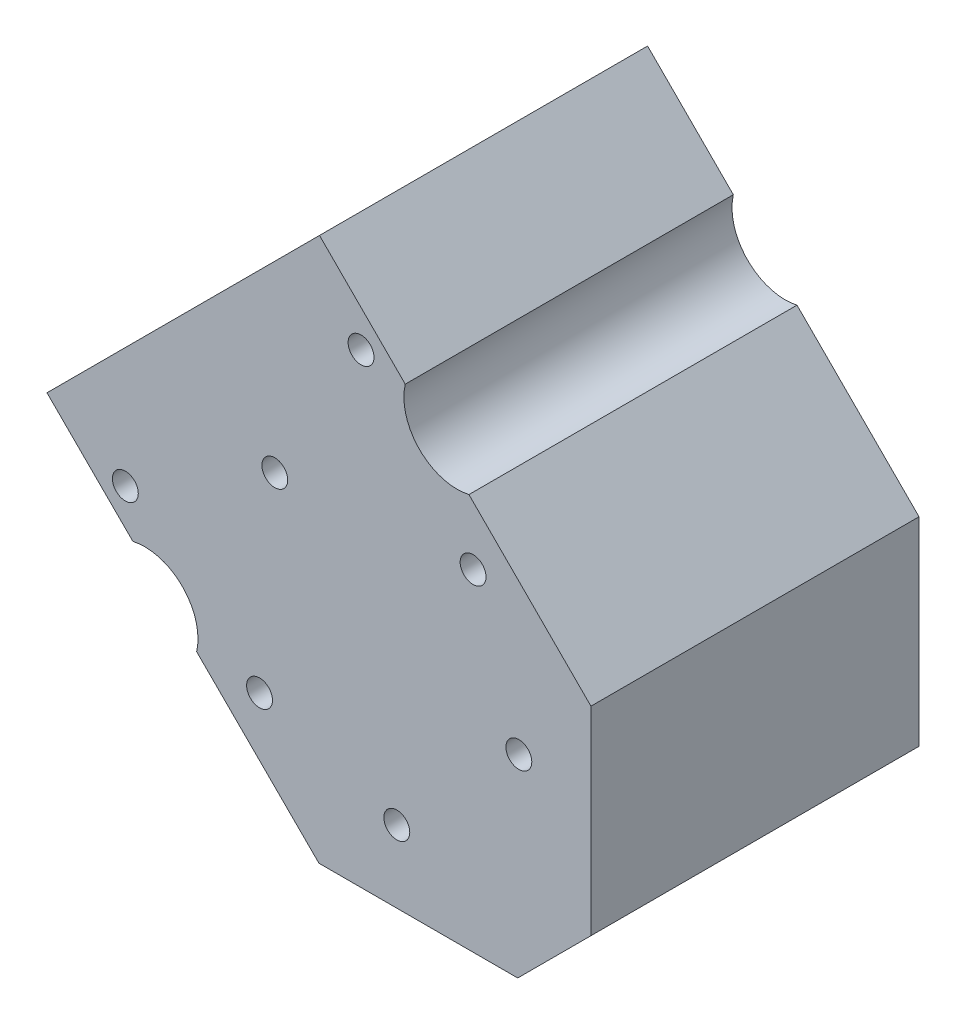
ISO-10303-21;
HEADER;
FILE_DESCRIPTION(('STEP AP214'),'2;1');
FILE_NAME('part.step','',(''),(''),'','','');
FILE_SCHEMA(('AUTOMOTIVE_DESIGN { 1 0 10303 214 1 1 1 1 }'));
ENDSEC;
DATA;
#1=APPLICATION_CONTEXT('core data for automotive mechanical design processes');
#2=APPLICATION_PROTOCOL_DEFINITION('international standard','automotive_design',2000,#1);
#3=PRODUCT_CONTEXT('',#1,'mechanical');
#4=PRODUCT('Part','Part','',(#3));
#5=PRODUCT_RELATED_PRODUCT_CATEGORY('part','',(#4));
#6=PRODUCT_DEFINITION_FORMATION('','',#4);
#7=PRODUCT_DEFINITION_CONTEXT('part definition',#1,'design');
#8=PRODUCT_DEFINITION('design','',#6,#7);
#9=PRODUCT_DEFINITION_SHAPE('','',#8);
#10=(LENGTH_UNIT() NAMED_UNIT(*) SI_UNIT(.MILLI.,.METRE.));
#11=(NAMED_UNIT(*) PLANE_ANGLE_UNIT() SI_UNIT($,.RADIAN.));
#12=(NAMED_UNIT(*) SI_UNIT($,.STERADIAN.) SOLID_ANGLE_UNIT());
#13=UNCERTAINTY_MEASURE_WITH_UNIT(LENGTH_MEASURE(1.E-05),#10,'distance_accuracy_value','');
#14=(GEOMETRIC_REPRESENTATION_CONTEXT(3) GLOBAL_UNCERTAINTY_ASSIGNED_CONTEXT((#13)) GLOBAL_UNIT_ASSIGNED_CONTEXT((#10,
#11,#12)) REPRESENTATION_CONTEXT('',''));
#15=CARTESIAN_POINT('',(0.,0.,0.));
#16=DIRECTION('',(0.,0.,1.));
#17=DIRECTION('',(1.,0.,0.));
#18=AXIS2_PLACEMENT_3D('',#15,#16,#17);
#19=CARTESIAN_POINT('',(-35.4852813742383,27.,38.0226));
#20=DIRECTION('',(-0.707106781186544,0.707106781186551,0.));
#21=DIRECTION('',(-0.707106781186551,-0.707106781186544,0.));
#22=AXIS2_PLACEMENT_3D('',#19,#20,#21);
#23=PLANE('',#22);
#24=DIRECTION('',(0.707106781186551,0.707106781186544,0.));
#25=VECTOR('',#24,1.);
#26=CARTESIAN_POINT('',(-35.4852813742383,27.,0.));
#27=LINE('',#26,#25);
#28=CARTESIAN_POINT('',(-35.4852813742383,27.,0.));
#29=VERTEX_POINT('',#28);
#30=CARTESIAN_POINT('',(-26.9999999999997,35.4852813742385,0.));
#31=VERTEX_POINT('',#30);
#32=EDGE_CURVE('E147',#29,#31,#27,.T.);
#33=ORIENTED_EDGE('',*,*,#32,.T.);
#34=DIRECTION('',(0.,0.,-1.));
#35=VECTOR('',#34,1.);
#36=CARTESIAN_POINT('',(-26.9999999999997,35.4852813742385,38.0226));
#37=LINE('',#36,#35);
#38=CARTESIAN_POINT('',(-26.9999999999997,35.4852813742385,38.0226));
#39=VERTEX_POINT('',#38);
#40=EDGE_CURVE('E11',#39,#31,#37,.T.);
#41=ORIENTED_EDGE('',*,*,#40,.F.);
#42=DIRECTION('',(0.707106781186551,0.707106781186544,0.));
#43=VECTOR('',#42,1.);
#44=CARTESIAN_POINT('',(-35.4852813742383,27.,38.0226));
#45=LINE('',#44,#43);
#46=CARTESIAN_POINT('',(-35.4852813742383,27.,38.0226));
#47=VERTEX_POINT('',#46);
#48=EDGE_CURVE('E166',#47,#39,#45,.T.);
#49=ORIENTED_EDGE('',*,*,#48,.F.);
#50=DIRECTION('',(0.,0.,-1.));
#51=VECTOR('',#50,1.);
#52=CARTESIAN_POINT('',(-35.4852813742383,27.,38.0226));
#53=LINE('',#52,#51);
#54=EDGE_CURVE('E143',#47,#29,#53,.T.);
#55=ORIENTED_EDGE('',*,*,#54,.T.);
#56=EDGE_LOOP('',(#33,#41,#49,#55));
#57=FACE_BOUND('',#56,.T.);
#58=ADVANCED_FACE('F39',(#57),#23,.F.);
#59=CARTESIAN_POINT('',(-26.9999999999997,35.4852813742385,38.0226));
#60=DIRECTION('',(-1.,0.,0.));
#61=DIRECTION('',(0.,0.,1.));
#62=AXIS2_PLACEMENT_3D('',#59,#60,#61);
#63=PLANE('',#62);
#64=DIRECTION('',(0.,1.,0.));
#65=VECTOR('',#64,1.);
#66=CARTESIAN_POINT('',(-26.9999999999997,35.4852813742385,0.));
#67=LINE('',#66,#65);
#68=CARTESIAN_POINT('',(-26.9999999999997,58.5251089466039,0.));
#69=VERTEX_POINT('',#68);
#70=EDGE_CURVE('E150',#31,#69,#67,.T.);
#71=ORIENTED_EDGE('',*,*,#70,.T.);
#72=DIRECTION('',(0.,0.,-1.));
#73=VECTOR('',#72,1.);
#74=CARTESIAN_POINT('',(-26.9999999999997,58.5251089466039,38.0226));
#75=LINE('',#74,#73);
#76=CARTESIAN_POINT('',(-26.9999999999997,58.5251089466039,38.0226));
#77=VERTEX_POINT('',#76);
#78=EDGE_CURVE('E47',#77,#69,#75,.T.);
#79=ORIENTED_EDGE('',*,*,#78,.F.);
#80=DIRECTION('',(0.,1.,0.));
#81=VECTOR('',#80,1.);
#82=CARTESIAN_POINT('',(-26.9999999999997,35.4852813742385,38.0226));
#83=LINE('',#82,#81);
#84=EDGE_CURVE('E104',#39,#77,#83,.T.);
#85=ORIENTED_EDGE('',*,*,#84,.F.);
#86=ORIENTED_EDGE('',*,*,#40,.T.);
#87=EDGE_LOOP('',(#71,#79,#85,#86));
#88=FACE_BOUND('',#87,.T.);
#89=ADVANCED_FACE('F282',(#88),#63,.F.);
#90=CARTESIAN_POINT('',(-26.9999999999997,58.5251089466039,38.0226));
#91=DIRECTION('',(-0.707759513444588,-0.706453445832547,0.));
#92=DIRECTION('',(0.706453445832547,-0.707759513444588,0.));
#93=AXIS2_PLACEMENT_3D('',#90,#91,#92);
#94=PLANE('',#93);
#95=DIRECTION('',(-0.706453445832547,0.707759513444588,0.));
#96=VECTOR('',#95,1.);
#97=CARTESIAN_POINT('',(-26.9999999999997,58.5251089466039,0.));
#98=LINE('',#97,#96);
#99=CARTESIAN_POINT('',(-41.1410793645048,72.6923318678659,0.));
#100=VERTEX_POINT('',#99);
#101=EDGE_CURVE('E153',#69,#100,#98,.T.);
#102=ORIENTED_EDGE('',*,*,#101,.T.);
#103=DIRECTION('',(0.,0.,-1.));
#104=VECTOR('',#103,1.);
#105=CARTESIAN_POINT('',(-41.1410793645048,72.6923318678659,38.0226));
#106=LINE('',#105,#104);
#107=CARTESIAN_POINT('',(-41.1410793645048,72.6923318678659,38.0226));
#108=VERTEX_POINT('',#107);
#109=EDGE_CURVE('E179',#108,#100,#106,.T.);
#110=ORIENTED_EDGE('',*,*,#109,.F.);
#111=DIRECTION('',(-0.706453445832547,0.707759513444588,0.));
#112=VECTOR('',#111,1.);
#113=CARTESIAN_POINT('',(-26.9999999999997,58.5251089466039,38.0226));
#114=LINE('',#113,#112);
#115=EDGE_CURVE('E187',#77,#108,#114,.T.);
#116=ORIENTED_EDGE('',*,*,#115,.F.);
#117=ORIENTED_EDGE('',*,*,#78,.T.);
#118=EDGE_LOOP('',(#102,#110,#116,#117));
#119=FACE_BOUND('',#118,.T.);
#120=ADVANCED_FACE('F185',(#119),#94,.F.);
#121=CARTESIAN_POINT('',(-42.5030038577654,78.7126909334408,38.0226));
#122=DIRECTION('',(0.,0.,-1.));
#123=DIRECTION('',(-1.,0.,0.));
#124=AXIS2_PLACEMENT_3D('',#121,#122,#123);
#125=CYLINDRICAL_SURFACE('',#124,6.17248423276982);
#126=CARTESIAN_POINT('',(-42.5030038577654,78.7126909334408,0.));
#127=DIRECTION('',(0.,0.,-1.));
#128=DIRECTION('',(1.,0.,0.));
#129=AXIS2_PLACEMENT_3D('',#126,#127,#128);
#130=CIRCLE('',#129,6.17248423276982);
#131=CARTESIAN_POINT('',(-48.5208371005556,80.0857330543389,0.));
#132=VERTEX_POINT('',#131);
#133=EDGE_CURVE('E155',#100,#132,#130,.T.);
#134=ORIENTED_EDGE('',*,*,#133,.T.);
#135=DIRECTION('',(0.,0.,-1.));
#136=VECTOR('',#135,1.);
#137=CARTESIAN_POINT('',(-48.5208371005556,80.0857330543389,38.0226));
#138=LINE('',#137,#136);
#139=CARTESIAN_POINT('',(-48.5208371005556,80.0857330543389,38.0226));
#140=VERTEX_POINT('',#139);
#141=EDGE_CURVE('E176',#140,#132,#138,.T.);
#142=ORIENTED_EDGE('',*,*,#141,.F.);
#143=CARTESIAN_POINT('',(-42.5030038577654,78.7126909334408,38.0226));
#144=DIRECTION('',(0.,0.,-1.));
#145=DIRECTION('',(1.,0.,0.));
#146=AXIS2_PLACEMENT_3D('',#143,#144,#145);
#147=CIRCLE('',#146,6.17248423276982);
#148=EDGE_CURVE('E205',#108,#140,#147,.T.);
#149=ORIENTED_EDGE('',*,*,#148,.F.);
#150=ORIENTED_EDGE('',*,*,#109,.T.);
#151=EDGE_LOOP('',(#134,#142,#149,#150));
#152=FACE_BOUND('',#151,.T.);
#153=ADVANCED_FACE('F196',(#152),#125,.F.);
#154=CARTESIAN_POINT('',(-48.5208371005556,80.0857330543389,38.0226));
#155=DIRECTION('',(-0.707759513444588,-0.706453445832548,0.));
#156=DIRECTION('',(0.706453445832548,-0.707759513444588,0.));
#157=AXIS2_PLACEMENT_3D('',#154,#155,#156);
#158=PLANE('',#157);
#159=DIRECTION('',(-0.706453445832548,0.707759513444588,0.));
#160=VECTOR('',#159,1.);
#161=CARTESIAN_POINT('',(-48.5208371005556,80.0857330543389,0.));
#162=LINE('',#161,#160);
#163=CARTESIAN_POINT('',(-58.4583659368675,90.0416340631321,0.));
#164=VERTEX_POINT('',#163);
#165=EDGE_CURVE('E157',#132,#164,#162,.T.);
#166=ORIENTED_EDGE('',*,*,#165,.T.);
#167=DIRECTION('',(0.,0.,-1.));
#168=VECTOR('',#167,1.);
#169=CARTESIAN_POINT('',(-58.4583659368675,90.0416340631321,38.0226));
#170=LINE('',#169,#168);
#171=CARTESIAN_POINT('',(-58.4583659368675,90.0416340631321,38.0226));
#172=VERTEX_POINT('',#171);
#173=EDGE_CURVE('E173',#172,#164,#170,.T.);
#174=ORIENTED_EDGE('',*,*,#173,.F.);
#175=DIRECTION('',(-0.706453445832548,0.707759513444588,0.));
#176=VECTOR('',#175,1.);
#177=CARTESIAN_POINT('',(-48.5208371005556,80.0857330543389,38.0226));
#178=LINE('',#177,#176);
#179=EDGE_CURVE('E202',#140,#172,#178,.T.);
#180=ORIENTED_EDGE('',*,*,#179,.F.);
#181=ORIENTED_EDGE('',*,*,#141,.T.);
#182=EDGE_LOOP('',(#166,#174,#180,#181));
#183=FACE_BOUND('',#182,.T.);
#184=ADVANCED_FACE('F200',(#183),#158,.F.);
#185=CARTESIAN_POINT('',(-58.4583659368675,90.0416340631321,38.0226));
#186=DIRECTION('',(0.707106781186544,-0.707106781186551,0.));
#187=DIRECTION('',(0.707106781186551,0.707106781186544,0.));
#188=AXIS2_PLACEMENT_3D('',#185,#186,#187);
#189=PLANE('',#188);
#190=DIRECTION('',(-0.707106781186551,-0.707106781186544,0.));
#191=VECTOR('',#190,1.);
#192=CARTESIAN_POINT('',(-58.4583659368675,90.0416340631321,0.));
#193=LINE('',#192,#191);
#194=CARTESIAN_POINT('',(-90.0416340631316,58.4583659368684,0.));
#195=VERTEX_POINT('',#194);
#196=EDGE_CURVE('E159',#164,#195,#193,.T.);
#197=ORIENTED_EDGE('',*,*,#196,.T.);
#198=DIRECTION('',(0.,0.,-1.));
#199=VECTOR('',#198,1.);
#200=CARTESIAN_POINT('',(-90.0416340631316,58.4583659368684,38.0226));
#201=LINE('',#200,#199);
#202=CARTESIAN_POINT('',(-90.0416340631316,58.4583659368684,38.0226));
#203=VERTEX_POINT('',#202);
#204=EDGE_CURVE('E170',#203,#195,#201,.T.);
#205=ORIENTED_EDGE('',*,*,#204,.F.);
#206=DIRECTION('',(-0.707106781186551,-0.707106781186544,0.));
#207=VECTOR('',#206,1.);
#208=CARTESIAN_POINT('',(-58.4583659368675,90.0416340631321,38.0226));
#209=LINE('',#208,#207);
#210=EDGE_CURVE('E204',#172,#203,#209,.T.);
#211=ORIENTED_EDGE('',*,*,#210,.F.);
#212=ORIENTED_EDGE('',*,*,#173,.T.);
#213=EDGE_LOOP('',(#197,#205,#211,#212));
#214=FACE_BOUND('',#213,.T.);
#215=ADVANCED_FACE('F294',(#214),#189,.F.);
#216=CARTESIAN_POINT('',(-80.0857330543385,48.5208371005563,38.0226));
#217=DIRECTION('',(0.706453445832556,0.707759513444579,0.));
#218=DIRECTION('',(-0.707759513444579,0.706453445832556,0.));
#219=AXIS2_PLACEMENT_3D('',#216,#217,#218);
#220=PLANE('',#219);
#221=DIRECTION('',(0.707759513444579,-0.706453445832556,0.));
#222=VECTOR('',#221,1.);
#223=CARTESIAN_POINT('',(-80.0857330543385,48.5208371005563,0.));
#224=LINE('',#223,#222);
#225=CARTESIAN_POINT('',(-80.0857330543385,48.5208371005563,0.));
#226=VERTEX_POINT('',#225);
#227=EDGE_CURVE('E161',#195,#226,#224,.T.);
#228=ORIENTED_EDGE('',*,*,#227,.T.);
#229=DIRECTION('',(0.,0.,-1.));
#230=VECTOR('',#229,1.);
#231=CARTESIAN_POINT('',(-80.0857330543385,48.5208371005563,38.0226));
#232=LINE('',#231,#230);
#233=CARTESIAN_POINT('',(-80.0857330543385,48.5208371005563,38.0226));
#234=VERTEX_POINT('',#233);
#235=EDGE_CURVE('E138',#234,#226,#232,.T.);
#236=ORIENTED_EDGE('',*,*,#235,.F.);
#237=DIRECTION('',(0.707759513444579,-0.706453445832556,0.));
#238=VECTOR('',#237,1.);
#239=CARTESIAN_POINT('',(-80.0857330543385,48.5208371005563,38.0226));
#240=LINE('',#239,#238);
#241=EDGE_CURVE('E129',#203,#234,#240,.T.);
#242=ORIENTED_EDGE('',*,*,#241,.F.);
#243=ORIENTED_EDGE('',*,*,#204,.T.);
#244=EDGE_LOOP('',(#228,#236,#242,#243));
#245=FACE_BOUND('',#244,.T.);
#246=ADVANCED_FACE('F291',(#245),#220,.F.);
#247=CARTESIAN_POINT('',(-78.7126909334404,42.5030038577661,38.0226));
#248=DIRECTION('',(0.,0.,-1.));
#249=DIRECTION('',(-1.,0.,0.));
#250=AXIS2_PLACEMENT_3D('',#247,#248,#249);
#251=CYLINDRICAL_SURFACE('',#250,6.17248423276982);
#252=CARTESIAN_POINT('',(-78.7126909334404,42.5030038577661,0.));
#253=DIRECTION('',(0.,0.,-1.));
#254=DIRECTION('',(-1.,0.,0.));
#255=AXIS2_PLACEMENT_3D('',#252,#253,#254);
#256=CIRCLE('',#255,6.17248423276982);
#257=CARTESIAN_POINT('',(-72.6923318678656,41.1410793645054,0.));
#258=VERTEX_POINT('',#257);
#259=EDGE_CURVE('E137',#226,#258,#256,.T.);
#260=ORIENTED_EDGE('',*,*,#259,.T.);
#261=DIRECTION('',(0.,0.,-1.));
#262=VECTOR('',#261,1.);
#263=CARTESIAN_POINT('',(-72.6923318678656,41.1410793645054,38.0226));
#264=LINE('',#263,#262);
#265=CARTESIAN_POINT('',(-72.6923318678656,41.1410793645054,38.0226));
#266=VERTEX_POINT('',#265);
#267=EDGE_CURVE('E134',#266,#258,#264,.T.);
#268=ORIENTED_EDGE('',*,*,#267,.F.);
#269=CARTESIAN_POINT('',(-78.7126909334404,42.5030038577661,38.0226));
#270=DIRECTION('',(0.,0.,-1.));
#271=DIRECTION('',(-1.,0.,0.));
#272=AXIS2_PLACEMENT_3D('',#269,#270,#271);
#273=CIRCLE('',#272,6.17248423276982);
#274=EDGE_CURVE('E123',#234,#266,#273,.T.);
#275=ORIENTED_EDGE('',*,*,#274,.F.);
#276=ORIENTED_EDGE('',*,*,#235,.T.);
#277=EDGE_LOOP('',(#260,#268,#275,#276));
#278=FACE_BOUND('',#277,.T.);
#279=ADVANCED_FACE('F135',(#278),#251,.F.);
#280=CARTESIAN_POINT('',(-58.5251089466036,27.0000000000003,38.0226));
#281=DIRECTION('',(0.706453445832551,0.707759513444585,0.));
#282=DIRECTION('',(-0.707759513444585,0.706453445832551,0.));
#283=AXIS2_PLACEMENT_3D('',#280,#281,#282);
#284=PLANE('',#283);
#285=DIRECTION('',(0.707759513444585,-0.706453445832551,0.));
#286=VECTOR('',#285,1.);
#287=CARTESIAN_POINT('',(-58.5251089466036,27.0000000000003,0.));
#288=LINE('',#287,#286);
#289=CARTESIAN_POINT('',(-58.5251089466036,27.0000000000003,0.));
#290=VERTEX_POINT('',#289);
#291=EDGE_CURVE('E90',#258,#290,#288,.T.);
#292=ORIENTED_EDGE('',*,*,#291,.T.);
#293=DIRECTION('',(0.,0.,-1.));
#294=VECTOR('',#293,1.);
#295=CARTESIAN_POINT('',(-58.5251089466036,27.0000000000003,38.0226));
#296=LINE('',#295,#294);
#297=CARTESIAN_POINT('',(-58.5251089466036,27.0000000000003,38.0226));
#298=VERTEX_POINT('',#297);
#299=EDGE_CURVE('E139',#298,#290,#296,.T.);
#300=ORIENTED_EDGE('',*,*,#299,.F.);
#301=DIRECTION('',(0.707759513444585,-0.706453445832551,0.));
#302=VECTOR('',#301,1.);
#303=CARTESIAN_POINT('',(-58.5251089466036,27.0000000000003,38.0226));
#304=LINE('',#303,#302);
#305=EDGE_CURVE('E127',#266,#298,#304,.T.);
#306=ORIENTED_EDGE('',*,*,#305,.F.);
#307=ORIENTED_EDGE('',*,*,#267,.T.);
#308=EDGE_LOOP('',(#292,#300,#306,#307));
#309=FACE_BOUND('',#308,.T.);
#310=ADVANCED_FACE('F141',(#309),#284,.F.);
#311=CARTESIAN_POINT('',(-58.5251089466036,27.0000000000003,38.0226));
#312=DIRECTION('',(0.,1.,0.));
#313=DIRECTION('',(-1.,0.,0.));
#314=AXIS2_PLACEMENT_3D('',#311,#312,#313);
#315=PLANE('',#314);
#316=DIRECTION('',(1.,0.,0.));
#317=VECTOR('',#316,1.);
#318=CARTESIAN_POINT('',(-58.5251089466036,27.0000000000003,0.));
#319=LINE('',#318,#317);
#320=EDGE_CURVE('E96',#290,#29,#319,.T.);
#321=ORIENTED_EDGE('',*,*,#320,.T.);
#322=ORIENTED_EDGE('',*,*,#54,.F.);
#323=DIRECTION('',(1.,0.,0.));
#324=VECTOR('',#323,1.);
#325=CARTESIAN_POINT('',(-58.5251089466036,27.0000000000003,38.0226));
#326=LINE('',#325,#324);
#327=EDGE_CURVE('E55',#298,#47,#326,.T.);
#328=ORIENTED_EDGE('',*,*,#327,.F.);
#329=ORIENTED_EDGE('',*,*,#299,.T.);
#330=EDGE_LOOP('',(#321,#322,#328,#329));
#331=FACE_BOUND('',#330,.T.);
#332=ADVANCED_FACE('F259',(#331),#315,.F.);
#333=CARTESIAN_POINT('',(-42.5030038577654,78.7126909334408,38.0226));
#334=DIRECTION('',(0.,0.,1.));
#335=DIRECTION('',(1.,0.,0.));
#336=AXIS2_PLACEMENT_3D('',#333,#334,#335);
#337=PLANE('',#336);
#338=CARTESIAN_POINT('',(-65.4073772597559,40.6586399182261,38.0226));
#339=DIRECTION('',(0.,0.,1.));
#340=DIRECTION('',(1.,0.,0.));
#341=AXIS2_PLACEMENT_3D('',#338,#339,#340);
#342=CIRCLE('',#341,1.5);
#343=CARTESIAN_POINT('',(-63.9073772597559,40.6586399182261,38.0226));
#344=VERTEX_POINT('',#343);
#345=EDGE_CURVE('E234',#344,#344,#342,.T.);
#346=ORIENTED_EDGE('',*,*,#345,.F.);
#347=EDGE_LOOP('',(#346));
#348=FACE_BOUND('',#347,.T.);
#349=CARTESIAN_POINT('',(-40.6586399182268,65.4073772597554,38.0226));
#350=DIRECTION('',(0.,0.,1.));
#351=DIRECTION('',(1.,0.,0.));
#352=AXIS2_PLACEMENT_3D('',#349,#350,#351);
#353=CIRCLE('',#352,1.5);
#354=CARTESIAN_POINT('',(-39.1586399182268,65.4073772597554,38.0226));
#355=VERTEX_POINT('',#354);
#356=EDGE_CURVE('E223',#355,#355,#353,.T.);
#357=ORIENTED_EDGE('',*,*,#356,.F.);
#358=EDGE_LOOP('',(#357));
#359=FACE_BOUND('',#358,.T.);
#360=CARTESIAN_POINT('',(-80.9601183824785,53.639610306789,38.0226));
#361=DIRECTION('',(0.,0.,1.));
#362=DIRECTION('',(1.,0.,0.));
#363=AXIS2_PLACEMENT_3D('',#360,#361,#362);
#364=CIRCLE('',#363,1.50000000000008);
#365=CARTESIAN_POINT('',(-79.4601183824784,53.639610306789,38.0226));
#366=VERTEX_POINT('',#365);
#367=EDGE_CURVE('E222',#366,#366,#364,.T.);
#368=ORIENTED_EDGE('',*,*,#367,.F.);
#369=EDGE_LOOP('',(#368));
#370=FACE_BOUND('',#369,.T.);
#371=CARTESIAN_POINT('',(-53.6396103067898,80.9601183824778,38.0226));
#372=DIRECTION('',(0.,0.,1.));
#373=DIRECTION('',(1.,0.,0.));
#374=AXIS2_PLACEMENT_3D('',#371,#372,#373);
#375=CIRCLE('',#374,1.5);
#376=CARTESIAN_POINT('',(-52.1396103067898,80.9601183824778,38.0226));
#377=VERTEX_POINT('',#376);
#378=EDGE_CURVE('E216',#377,#377,#375,.T.);
#379=ORIENTED_EDGE('',*,*,#378,.F.);
#380=EDGE_LOOP('',(#379));
#381=FACE_BOUND('',#380,.T.);
#382=CARTESIAN_POINT('',(-49.4974746830585,35.3553390593271,38.0226));
#383=DIRECTION('',(0.,0.,1.));
#384=DIRECTION('',(1.,0.,0.));
#385=AXIS2_PLACEMENT_3D('',#382,#383,#384);
#386=CIRCLE('',#385,1.5);
#387=CARTESIAN_POINT('',(-47.9974746830585,35.3553390593271,38.0226));
#388=VERTEX_POINT('',#387);
#389=EDGE_CURVE('E235',#388,#388,#386,.T.);
#390=ORIENTED_EDGE('',*,*,#389,.F.);
#391=EDGE_LOOP('',(#390));
#392=FACE_BOUND('',#391,.T.);
#393=CARTESIAN_POINT('',(-35.3553390593276,49.4974746830581,38.0226));
#394=DIRECTION('',(0.,0.,1.));
#395=DIRECTION('',(1.,0.,0.));
#396=AXIS2_PLACEMENT_3D('',#393,#394,#395);
#397=CIRCLE('',#396,1.5);
#398=CARTESIAN_POINT('',(-33.8553390593276,49.4974746830581,38.0226));
#399=VERTEX_POINT('',#398);
#400=EDGE_CURVE('E246',#399,#399,#397,.T.);
#401=ORIENTED_EDGE('',*,*,#400,.F.);
#402=EDGE_LOOP('',(#401));
#403=FACE_BOUND('',#402,.T.);
#404=CARTESIAN_POINT('',(-63.6396103067897,63.639610306789,38.0226));
#405=DIRECTION('',(0.,0.,1.));
#406=DIRECTION('',(1.,0.,0.));
#407=AXIS2_PLACEMENT_3D('',#404,#405,#406);
#408=CIRCLE('',#407,1.50000000000007);
#409=CARTESIAN_POINT('',(-62.1396103067897,63.639610306789,38.0226));
#410=VERTEX_POINT('',#409);
#411=EDGE_CURVE('E213',#410,#410,#408,.T.);
#412=ORIENTED_EDGE('',*,*,#411,.F.);
#413=EDGE_LOOP('',(#412));
#414=FACE_BOUND('',#413,.T.);
#415=ORIENTED_EDGE('',*,*,#48,.T.);
#416=ORIENTED_EDGE('',*,*,#84,.T.);
#417=ORIENTED_EDGE('',*,*,#115,.T.);
#418=ORIENTED_EDGE('',*,*,#148,.T.);
#419=ORIENTED_EDGE('',*,*,#179,.T.);
#420=ORIENTED_EDGE('',*,*,#210,.T.);
#421=ORIENTED_EDGE('',*,*,#241,.T.);
#422=ORIENTED_EDGE('',*,*,#274,.T.);
#423=ORIENTED_EDGE('',*,*,#305,.T.);
#424=ORIENTED_EDGE('',*,*,#327,.T.);
#425=EDGE_LOOP('',(#415,#416,#417,#418,#419,#420,#421,#422,#423,#424));
#426=FACE_BOUND('',#425,.T.);
#427=ADVANCED_FACE('F125',(#348,#359,#370,#381,#392,#403,#414,#426),#337,.T.);
#428=CARTESIAN_POINT('',(-42.5030038577654,78.7126909334408,0.));
#429=DIRECTION('',(0.,0.,1.));
#430=DIRECTION('',(1.,0.,0.));
#431=AXIS2_PLACEMENT_3D('',#428,#429,#430);
#432=PLANE('',#431);
#433=CARTESIAN_POINT('',(-65.4073772597559,40.6586399182261,0.));
#434=DIRECTION('',(0.,0.,1.));
#435=DIRECTION('',(1.,0.,0.));
#436=AXIS2_PLACEMENT_3D('',#433,#434,#435);
#437=CIRCLE('',#436,1.5);
#438=CARTESIAN_POINT('',(-63.9073772597559,40.6586399182261,0.));
#439=VERTEX_POINT('',#438);
#440=EDGE_CURVE('E231',#439,#439,#437,.T.);
#441=ORIENTED_EDGE('',*,*,#440,.T.);
#442=EDGE_LOOP('',(#441));
#443=FACE_BOUND('',#442,.T.);
#444=CARTESIAN_POINT('',(-40.6586399182268,65.4073772597554,0.));
#445=DIRECTION('',(0.,0.,1.));
#446=DIRECTION('',(1.,0.,0.));
#447=AXIS2_PLACEMENT_3D('',#444,#445,#446);
#448=CIRCLE('',#447,1.5);
#449=CARTESIAN_POINT('',(-39.1586399182268,65.4073772597554,0.));
#450=VERTEX_POINT('',#449);
#451=EDGE_CURVE('E238',#450,#450,#448,.T.);
#452=ORIENTED_EDGE('',*,*,#451,.T.);
#453=EDGE_LOOP('',(#452));
#454=FACE_BOUND('',#453,.T.);
#455=CARTESIAN_POINT('',(-80.9601183824785,53.639610306789,0.));
#456=DIRECTION('',(0.,0.,1.));
#457=DIRECTION('',(1.,0.,0.));
#458=AXIS2_PLACEMENT_3D('',#455,#456,#457);
#459=CIRCLE('',#458,1.50000000000008);
#460=CARTESIAN_POINT('',(-79.4601183824784,53.639610306789,0.));
#461=VERTEX_POINT('',#460);
#462=EDGE_CURVE('E219',#461,#461,#459,.T.);
#463=ORIENTED_EDGE('',*,*,#462,.T.);
#464=EDGE_LOOP('',(#463));
#465=FACE_BOUND('',#464,.T.);
#466=CARTESIAN_POINT('',(-53.6396103067898,80.9601183824778,0.));
#467=DIRECTION('',(0.,0.,1.));
#468=DIRECTION('',(1.,0.,0.));
#469=AXIS2_PLACEMENT_3D('',#466,#467,#468);
#470=CIRCLE('',#469,1.5);
#471=CARTESIAN_POINT('',(-52.1396103067898,80.9601183824778,0.));
#472=VERTEX_POINT('',#471);
#473=EDGE_CURVE('E226',#472,#472,#470,.T.);
#474=ORIENTED_EDGE('',*,*,#473,.T.);
#475=EDGE_LOOP('',(#474));
#476=FACE_BOUND('',#475,.T.);
#477=CARTESIAN_POINT('',(-49.4974746830585,35.3553390593271,0.));
#478=DIRECTION('',(0.,0.,1.));
#479=DIRECTION('',(1.,0.,0.));
#480=AXIS2_PLACEMENT_3D('',#477,#478,#479);
#481=CIRCLE('',#480,1.5);
#482=CARTESIAN_POINT('',(-47.9974746830585,35.3553390593271,0.));
#483=VERTEX_POINT('',#482);
#484=EDGE_CURVE('E249',#483,#483,#481,.T.);
#485=ORIENTED_EDGE('',*,*,#484,.T.);
#486=EDGE_LOOP('',(#485));
#487=FACE_BOUND('',#486,.T.);
#488=CARTESIAN_POINT('',(-35.3553390593276,49.4974746830581,0.));
#489=DIRECTION('',(0.,0.,1.));
#490=DIRECTION('',(1.,0.,0.));
#491=AXIS2_PLACEMENT_3D('',#488,#489,#490);
#492=CIRCLE('',#491,1.5);
#493=CARTESIAN_POINT('',(-33.8553390593276,49.4974746830581,0.));
#494=VERTEX_POINT('',#493);
#495=EDGE_CURVE('E243',#494,#494,#492,.T.);
#496=ORIENTED_EDGE('',*,*,#495,.T.);
#497=EDGE_LOOP('',(#496));
#498=FACE_BOUND('',#497,.T.);
#499=CARTESIAN_POINT('',(-63.6396103067897,63.639610306789,0.));
#500=DIRECTION('',(0.,0.,1.));
#501=DIRECTION('',(1.,0.,0.));
#502=AXIS2_PLACEMENT_3D('',#499,#500,#501);
#503=CIRCLE('',#502,1.50000000000007);
#504=CARTESIAN_POINT('',(-62.1396103067897,63.639610306789,0.));
#505=VERTEX_POINT('',#504);
#506=EDGE_CURVE('E151',#505,#505,#503,.T.);
#507=ORIENTED_EDGE('',*,*,#506,.T.);
#508=EDGE_LOOP('',(#507));
#509=FACE_BOUND('',#508,.T.);
#510=ORIENTED_EDGE('',*,*,#32,.F.);
#511=ORIENTED_EDGE('',*,*,#320,.F.);
#512=ORIENTED_EDGE('',*,*,#291,.F.);
#513=ORIENTED_EDGE('',*,*,#259,.F.);
#514=ORIENTED_EDGE('',*,*,#227,.F.);
#515=ORIENTED_EDGE('',*,*,#196,.F.);
#516=ORIENTED_EDGE('',*,*,#165,.F.);
#517=ORIENTED_EDGE('',*,*,#133,.F.);
#518=ORIENTED_EDGE('',*,*,#101,.F.);
#519=ORIENTED_EDGE('',*,*,#70,.F.);
#520=EDGE_LOOP('',(#510,#511,#512,#513,#514,#515,#516,#517,#518,#519));
#521=FACE_BOUND('',#520,.T.);
#522=ADVANCED_FACE('F191',(#443,#454,#465,#476,#487,#498,#509,#521),#432,.F.);
#523=CARTESIAN_POINT('',(-63.6396103067897,63.639610306789,0.));
#524=DIRECTION('',(0.,0.,1.));
#525=DIRECTION('',(1.,0.,0.));
#526=AXIS2_PLACEMENT_3D('',#523,#524,#525);
#527=CYLINDRICAL_SURFACE('',#526,1.50000000000007);
#528=ORIENTED_EDGE('',*,*,#506,.F.);
#529=EDGE_LOOP('',(#528));
#530=FACE_BOUND('',#529,.T.);
#531=ORIENTED_EDGE('',*,*,#411,.T.);
#532=EDGE_LOOP('',(#531));
#533=FACE_BOUND('',#532,.T.);
#534=ADVANCED_FACE('F266',(#530,#533),#527,.F.);
#535=CARTESIAN_POINT('',(-35.3553390593276,49.4974746830581,0.));
#536=DIRECTION('',(0.,0.,1.));
#537=DIRECTION('',(1.,0.,0.));
#538=AXIS2_PLACEMENT_3D('',#535,#536,#537);
#539=CYLINDRICAL_SURFACE('',#538,1.5);
#540=ORIENTED_EDGE('',*,*,#495,.F.);
#541=EDGE_LOOP('',(#540));
#542=FACE_BOUND('',#541,.T.);
#543=ORIENTED_EDGE('',*,*,#400,.T.);
#544=EDGE_LOOP('',(#543));
#545=FACE_BOUND('',#544,.T.);
#546=ADVANCED_FACE('F268',(#542,#545),#539,.F.);
#547=CARTESIAN_POINT('',(-49.4974746830585,35.3553390593271,0.));
#548=DIRECTION('',(0.,0.,1.));
#549=DIRECTION('',(1.,0.,0.));
#550=AXIS2_PLACEMENT_3D('',#547,#548,#549);
#551=CYLINDRICAL_SURFACE('',#550,1.5);
#552=ORIENTED_EDGE('',*,*,#484,.F.);
#553=EDGE_LOOP('',(#552));
#554=FACE_BOUND('',#553,.T.);
#555=ORIENTED_EDGE('',*,*,#389,.T.);
#556=EDGE_LOOP('',(#555));
#557=FACE_BOUND('',#556,.T.);
#558=ADVANCED_FACE('F255',(#554,#557),#551,.F.);
#559=CARTESIAN_POINT('',(-53.6396103067898,80.9601183824778,0.));
#560=DIRECTION('',(0.,0.,1.));
#561=DIRECTION('',(1.,0.,0.));
#562=AXIS2_PLACEMENT_3D('',#559,#560,#561);
#563=CYLINDRICAL_SURFACE('',#562,1.5);
#564=ORIENTED_EDGE('',*,*,#473,.F.);
#565=EDGE_LOOP('',(#564));
#566=FACE_BOUND('',#565,.T.);
#567=ORIENTED_EDGE('',*,*,#378,.T.);
#568=EDGE_LOOP('',(#567));
#569=FACE_BOUND('',#568,.T.);
#570=ADVANCED_FACE('F387',(#566,#569),#563,.F.);
#571=CARTESIAN_POINT('',(-80.9601183824785,53.639610306789,0.));
#572=DIRECTION('',(0.,0.,1.));
#573=DIRECTION('',(1.,0.,0.));
#574=AXIS2_PLACEMENT_3D('',#571,#572,#573);
#575=CYLINDRICAL_SURFACE('',#574,1.50000000000008);
#576=ORIENTED_EDGE('',*,*,#462,.F.);
#577=EDGE_LOOP('',(#576));
#578=FACE_BOUND('',#577,.T.);
#579=ORIENTED_EDGE('',*,*,#367,.T.);
#580=EDGE_LOOP('',(#579));
#581=FACE_BOUND('',#580,.T.);
#582=ADVANCED_FACE('F397',(#578,#581),#575,.F.);
#583=CARTESIAN_POINT('',(-40.6586399182268,65.4073772597554,0.));
#584=DIRECTION('',(0.,0.,1.));
#585=DIRECTION('',(1.,0.,0.));
#586=AXIS2_PLACEMENT_3D('',#583,#584,#585);
#587=CYLINDRICAL_SURFACE('',#586,1.5);
#588=ORIENTED_EDGE('',*,*,#451,.F.);
#589=EDGE_LOOP('',(#588));
#590=FACE_BOUND('',#589,.T.);
#591=ORIENTED_EDGE('',*,*,#356,.T.);
#592=EDGE_LOOP('',(#591));
#593=FACE_BOUND('',#592,.T.);
#594=ADVANCED_FACE('F407',(#590,#593),#587,.F.);
#595=CARTESIAN_POINT('',(-65.4073772597559,40.6586399182261,0.));
#596=DIRECTION('',(0.,0.,1.));
#597=DIRECTION('',(1.,0.,0.));
#598=AXIS2_PLACEMENT_3D('',#595,#596,#597);
#599=CYLINDRICAL_SURFACE('',#598,1.5);
#600=ORIENTED_EDGE('',*,*,#440,.F.);
#601=EDGE_LOOP('',(#600));
#602=FACE_BOUND('',#601,.T.);
#603=ORIENTED_EDGE('',*,*,#345,.T.);
#604=EDGE_LOOP('',(#603));
#605=FACE_BOUND('',#604,.T.);
#606=ADVANCED_FACE('F416',(#602,#605),#599,.F.);
#607=CLOSED_SHELL('',(#58,#89,#120,#153,#184,#215,#246,#279,#310,#332,#427,#522,#534,#546,#558,
#570,#582,#594,#606));
#608=MANIFOLD_SOLID_BREP('B2',#607);
#609=ADVANCED_BREP_SHAPE_REPRESENTATION('',(#18,#608),#14);
#610=SHAPE_DEFINITION_REPRESENTATION(#9,#609);
ENDSEC;
END-ISO-10303-21;
